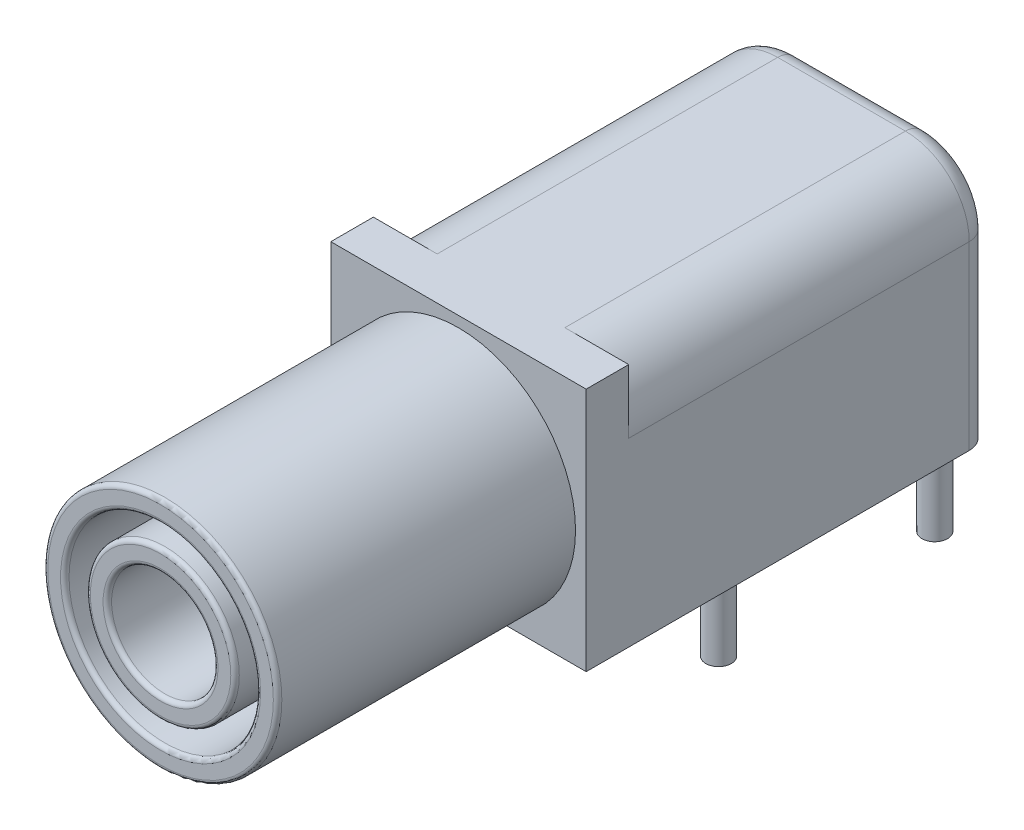
ISO-10303-21;
HEADER;
FILE_DESCRIPTION(('STEP AP214'),'2;1');
FILE_NAME('part.step','',(''),(''),'','','');
FILE_SCHEMA(('AUTOMOTIVE_DESIGN { 1 0 10303 214 1 1 1 1 }'));
ENDSEC;
DATA;
#1=APPLICATION_CONTEXT('core data for automotive mechanical design processes');
#2=APPLICATION_PROTOCOL_DEFINITION('international standard','automotive_design',2000,#1);
#3=PRODUCT_CONTEXT('',#1,'mechanical');
#4=PRODUCT('Part','Part','',(#3));
#5=PRODUCT_RELATED_PRODUCT_CATEGORY('part','',(#4));
#6=PRODUCT_DEFINITION_FORMATION('','',#4);
#7=PRODUCT_DEFINITION_CONTEXT('part definition',#1,'design');
#8=PRODUCT_DEFINITION('design','',#6,#7);
#9=PRODUCT_DEFINITION_SHAPE('','',#8);
#10=(LENGTH_UNIT() NAMED_UNIT(*) SI_UNIT(.MILLI.,.METRE.));
#11=(NAMED_UNIT(*) PLANE_ANGLE_UNIT() SI_UNIT($,.RADIAN.));
#12=(NAMED_UNIT(*) SI_UNIT($,.STERADIAN.) SOLID_ANGLE_UNIT());
#13=UNCERTAINTY_MEASURE_WITH_UNIT(LENGTH_MEASURE(1.E-05),#10,'distance_accuracy_value','');
#14=(GEOMETRIC_REPRESENTATION_CONTEXT(3) GLOBAL_UNCERTAINTY_ASSIGNED_CONTEXT((#13)) GLOBAL_UNIT_ASSIGNED_CONTEXT((#10,
#11,#12)) REPRESENTATION_CONTEXT('',''));
#15=CARTESIAN_POINT('',(0.,0.,0.));
#16=DIRECTION('',(0.,0.,1.));
#17=DIRECTION('',(1.,0.,0.));
#18=AXIS2_PLACEMENT_3D('',#15,#16,#17);
#19=CARTESIAN_POINT('',(-6.,-5.5,-19.));
#20=DIRECTION('',(0.,-1.,0.));
#21=DIRECTION('',(0.,0.,-1.));
#22=AXIS2_PLACEMENT_3D('',#19,#20,#21);
#23=PLANE('',#22);
#24=CARTESIAN_POINT('',(-5.08,-5.5,-7.14));
#25=DIRECTION('',(0.,-1.,0.));
#26=DIRECTION('',(0.,0.,1.));
#27=AXIS2_PLACEMENT_3D('',#24,#25,#26);
#28=CIRCLE('',#27,0.6);
#29=CARTESIAN_POINT('',(-5.08,-5.5,-6.54));
#30=VERTEX_POINT('',#29);
#31=EDGE_CURVE('E302',#30,#30,#28,.T.);
#32=ORIENTED_EDGE('',*,*,#31,.F.);
#33=EDGE_LOOP('',(#32));
#34=FACE_BOUND('',#33,.T.);
#35=CARTESIAN_POINT('',(5.08,-5.5,-17.3));
#36=DIRECTION('',(0.,-1.,0.));
#37=DIRECTION('',(0.,0.,-1.));
#38=AXIS2_PLACEMENT_3D('',#35,#36,#37);
#39=CIRCLE('',#38,0.6);
#40=CARTESIAN_POINT('',(5.08,-5.5,-17.9));
#41=VERTEX_POINT('',#40);
#42=EDGE_CURVE('E290',#41,#41,#39,.T.);
#43=ORIENTED_EDGE('',*,*,#42,.F.);
#44=EDGE_LOOP('',(#43));
#45=FACE_BOUND('',#44,.T.);
#46=DIRECTION('',(0.,0.,1.));
#47=VECTOR('',#46,1.);
#48=CARTESIAN_POINT('',(-6.,-5.5,-19.));
#49=LINE('',#48,#47);
#50=CARTESIAN_POINT('',(-6.,-5.5,-18.));
#51=VERTEX_POINT('',#50);
#52=CARTESIAN_POINT('',(-6.,-5.5,0.));
#53=VERTEX_POINT('',#52);
#54=EDGE_CURVE('E158',#51,#53,#49,.T.);
#55=ORIENTED_EDGE('',*,*,#54,.F.);
#56=CARTESIAN_POINT('',(-5.,-5.5,-18.));
#57=DIRECTION('',(0.,-1.,0.));
#58=DIRECTION('',(0.,0.,-1.));
#59=AXIS2_PLACEMENT_3D('',#56,#57,#58);
#60=CIRCLE('',#59,1.);
#61=CARTESIAN_POINT('',(-5.,-5.5,-19.));
#62=VERTEX_POINT('',#61);
#63=EDGE_CURVE('E227',#51,#62,#60,.T.);
#64=ORIENTED_EDGE('',*,*,#63,.T.);
#65=DIRECTION('',(1.,0.,0.));
#66=VECTOR('',#65,1.);
#67=CARTESIAN_POINT('',(-6.,-5.5,-19.));
#68=LINE('',#67,#66);
#69=CARTESIAN_POINT('',(5.,-5.5,-19.));
#70=VERTEX_POINT('',#69);
#71=EDGE_CURVE('E155',#62,#70,#68,.T.);
#72=ORIENTED_EDGE('',*,*,#71,.T.);
#73=CARTESIAN_POINT('',(5.,-5.5,-18.));
#74=DIRECTION('',(0.,-1.,0.));
#75=DIRECTION('',(0.,0.,-1.));
#76=AXIS2_PLACEMENT_3D('',#73,#74,#75);
#77=CIRCLE('',#76,1.);
#78=CARTESIAN_POINT('',(6.,-5.5,-18.));
#79=VERTEX_POINT('',#78);
#80=EDGE_CURVE('E225',#70,#79,#77,.T.);
#81=ORIENTED_EDGE('',*,*,#80,.T.);
#82=DIRECTION('',(0.,0.,1.));
#83=VECTOR('',#82,1.);
#84=CARTESIAN_POINT('',(6.,-5.5,-19.));
#85=LINE('',#84,#83);
#86=CARTESIAN_POINT('',(6.,-5.5,0.));
#87=VERTEX_POINT('',#86);
#88=EDGE_CURVE('E171',#79,#87,#85,.T.);
#89=ORIENTED_EDGE('',*,*,#88,.T.);
#90=DIRECTION('',(1.,0.,0.));
#91=VECTOR('',#90,1.);
#92=CARTESIAN_POINT('',(-6.,-5.5,0.));
#93=LINE('',#92,#91);
#94=CARTESIAN_POINT('',(0.,-5.5,0.));
#95=VERTEX_POINT('',#94);
#96=EDGE_CURVE('E168',#95,#87,#93,.T.);
#97=ORIENTED_EDGE('',*,*,#96,.F.);
#98=EDGE_CURVE('E159',#53,#95,#93,.T.);
#99=ORIENTED_EDGE('',*,*,#98,.F.);
#100=EDGE_LOOP('',(#55,#64,#72,#81,#89,#97,#99));
#101=FACE_BOUND('',#100,.T.);
#102=CARTESIAN_POINT('',(0.,-5.5,-13.5));
#103=DIRECTION('',(0.,-1.,0.));
#104=DIRECTION('',(0.,0.,-1.));
#105=AXIS2_PLACEMENT_3D('',#102,#103,#104);
#106=CIRCLE('',#105,1.1);
#107=CARTESIAN_POINT('',(0.,-5.5,-14.6));
#108=VERTEX_POINT('',#107);
#109=EDGE_CURVE('E284',#108,#108,#106,.T.);
#110=ORIENTED_EDGE('',*,*,#109,.F.);
#111=EDGE_LOOP('',(#110));
#112=FACE_BOUND('',#111,.T.);
#113=CARTESIAN_POINT('',(5.08,-5.5,-7.14));
#114=DIRECTION('',(0.,-1.,0.));
#115=DIRECTION('',(0.,0.,-1.));
#116=AXIS2_PLACEMENT_3D('',#113,#114,#115);
#117=CIRCLE('',#116,0.6);
#118=CARTESIAN_POINT('',(5.08,-5.5,-7.74));
#119=VERTEX_POINT('',#118);
#120=EDGE_CURVE('E296',#119,#119,#117,.T.);
#121=ORIENTED_EDGE('',*,*,#120,.F.);
#122=EDGE_LOOP('',(#121));
#123=FACE_BOUND('',#122,.T.);
#124=CARTESIAN_POINT('',(-5.08,-5.5,-17.3));
#125=DIRECTION('',(0.,-1.,0.));
#126=DIRECTION('',(0.,0.,1.));
#127=AXIS2_PLACEMENT_3D('',#124,#125,#126);
#128=CIRCLE('',#127,0.6);
#129=CARTESIAN_POINT('',(-5.08,-5.5,-16.7));
#130=VERTEX_POINT('',#129);
#131=EDGE_CURVE('E308',#130,#130,#128,.T.);
#132=ORIENTED_EDGE('',*,*,#131,.F.);
#133=EDGE_LOOP('',(#132));
#134=FACE_BOUND('',#133,.T.);
#135=ADVANCED_FACE('F40',(#34,#45,#101,#112,#123,#134),#23,.T.);
#136=CARTESIAN_POINT('',(-6.,6.,-19.));
#137=DIRECTION('',(0.,-1.,0.));
#138=DIRECTION('',(0.,0.,-1.));
#139=AXIS2_PLACEMENT_3D('',#136,#137,#138);
#140=PLANE('',#139);
#141=DIRECTION('',(0.,0.,-1.));
#142=VECTOR('',#141,1.);
#143=CARTESIAN_POINT('',(2.99999999999998,6.,-2.));
#144=LINE('',#143,#142);
#145=CARTESIAN_POINT('',(3.,6.,-2.));
#146=VERTEX_POINT('',#145);
#147=CARTESIAN_POINT('',(2.99999999999998,6.,-18.));
#148=VERTEX_POINT('',#147);
#149=EDGE_CURVE('E139',#146,#148,#144,.T.);
#150=ORIENTED_EDGE('',*,*,#149,.T.);
#151=DIRECTION('',(1.,0.,0.));
#152=VECTOR('',#151,1.);
#153=CARTESIAN_POINT('',(-2.99999999999998,6.,-18.));
#154=LINE('',#153,#152);
#155=CARTESIAN_POINT('',(-2.99999999999998,6.,-18.));
#156=VERTEX_POINT('',#155);
#157=EDGE_CURVE('E231',#148,#156,#154,.F.);
#158=ORIENTED_EDGE('',*,*,#157,.T.);
#159=DIRECTION('',(0.,0.,-1.));
#160=VECTOR('',#159,1.);
#161=CARTESIAN_POINT('',(-2.99999999999998,6.,-2.));
#162=LINE('',#161,#160);
#163=CARTESIAN_POINT('',(-2.99999999999998,6.,-2.));
#164=VERTEX_POINT('',#163);
#165=EDGE_CURVE('E144',#164,#156,#162,.T.);
#166=ORIENTED_EDGE('',*,*,#165,.F.);
#167=DIRECTION('',(1.,0.,0.));
#168=VECTOR('',#167,1.);
#169=CARTESIAN_POINT('',(-6.,6.,-2.));
#170=LINE('',#169,#168);
#171=CARTESIAN_POINT('',(-6.,6.,-2.));
#172=VERTEX_POINT('',#171);
#173=EDGE_CURVE('E149',#172,#164,#170,.T.);
#174=ORIENTED_EDGE('',*,*,#173,.F.);
#175=DIRECTION('',(0.,0.,1.));
#176=VECTOR('',#175,1.);
#177=CARTESIAN_POINT('',(-6.,6.,-19.));
#178=LINE('',#177,#176);
#179=CARTESIAN_POINT('',(-6.,6.,0.));
#180=VERTEX_POINT('',#179);
#181=EDGE_CURVE('E175',#172,#180,#178,.T.);
#182=ORIENTED_EDGE('',*,*,#181,.T.);
#183=DIRECTION('',(1.,0.,0.));
#184=VECTOR('',#183,1.);
#185=CARTESIAN_POINT('',(-6.,6.,0.));
#186=LINE('',#185,#184);
#187=CARTESIAN_POINT('',(6.,6.,0.));
#188=VERTEX_POINT('',#187);
#189=EDGE_CURVE('E162',#180,#188,#186,.T.);
#190=ORIENTED_EDGE('',*,*,#189,.T.);
#191=DIRECTION('',(0.,0.,1.));
#192=VECTOR('',#191,1.);
#193=CARTESIAN_POINT('',(6.,6.,-19.));
#194=LINE('',#193,#192);
#195=CARTESIAN_POINT('',(6.,6.,-2.));
#196=VERTEX_POINT('',#195);
#197=EDGE_CURVE('E173',#196,#188,#194,.T.);
#198=ORIENTED_EDGE('',*,*,#197,.F.);
#199=EDGE_CURVE('E132',#146,#196,#170,.T.);
#200=ORIENTED_EDGE('',*,*,#199,.F.);
#201=EDGE_LOOP('',(#150,#158,#166,#174,#182,#190,#198,#200));
#202=FACE_BOUND('',#201,.T.);
#203=ADVANCED_FACE('F324',(#202),#140,.F.);
#204=CARTESIAN_POINT('',(0.,0.,0.));
#205=DIRECTION('',(0.,0.,-1.));
#206=DIRECTION('',(-1.,0.,0.));
#207=AXIS2_PLACEMENT_3D('',#204,#205,#206);
#208=PLANE('',#207);
#209=CARTESIAN_POINT('',(0.,0.,0.));
#210=DIRECTION('',(0.,0.,1.));
#211=DIRECTION('',(1.,0.,0.));
#212=AXIS2_PLACEMENT_3D('',#209,#210,#211);
#213=CIRCLE('',#212,4.5);
#214=CARTESIAN_POINT('',(4.5,0.,0.));
#215=VERTEX_POINT('',#214);
#216=EDGE_CURVE('E177',#215,#215,#213,.T.);
#217=ORIENTED_EDGE('',*,*,#216,.T.);
#218=EDGE_LOOP('',(#217));
#219=FACE_BOUND('',#218,.T.);
#220=CARTESIAN_POINT('',(0.,0.,0.));
#221=DIRECTION('',(0.,0.,-1.));
#222=DIRECTION('',(-1.,0.,0.));
#223=AXIS2_PLACEMENT_3D('',#220,#221,#222);
#224=CIRCLE('',#223,3.5);
#225=CARTESIAN_POINT('',(-3.5,0.,0.));
#226=VERTEX_POINT('',#225);
#227=EDGE_CURVE('E183',#226,#226,#224,.F.);
#228=ORIENTED_EDGE('',*,*,#227,.F.);
#229=EDGE_LOOP('',(#228));
#230=FACE_BOUND('',#229,.T.);
#231=ADVANCED_FACE('F330',(#219,#230),#208,.F.);
#232=CARTESIAN_POINT('',(0.,0.,14.));
#233=DIRECTION('',(0.,0.,-1.));
#234=DIRECTION('',(-1.,0.,0.));
#235=AXIS2_PLACEMENT_3D('',#232,#233,#234);
#236=CYLINDRICAL_SURFACE('',#235,4.5);
#237=CARTESIAN_POINT('',(0.,0.,13.8));
#238=DIRECTION('',(0.,0.,1.));
#239=DIRECTION('',(1.,0.,0.));
#240=AXIS2_PLACEMENT_3D('',#237,#238,#239);
#241=CIRCLE('',#240,4.5);
#242=CARTESIAN_POINT('',(4.5,0.,13.8));
#243=VERTEX_POINT('',#242);
#244=EDGE_CURVE('E198',#243,#243,#241,.T.);
#245=ORIENTED_EDGE('',*,*,#244,.T.);
#246=EDGE_LOOP('',(#245));
#247=FACE_BOUND('',#246,.T.);
#248=ORIENTED_EDGE('',*,*,#216,.F.);
#249=EDGE_LOOP('',(#248));
#250=FACE_BOUND('',#249,.T.);
#251=ADVANCED_FACE('F351',(#247,#250),#236,.F.);
#252=CARTESIAN_POINT('',(0.,0.,14.));
#253=DIRECTION('',(0.,0.,-1.));
#254=DIRECTION('',(-1.,0.,0.));
#255=AXIS2_PLACEMENT_3D('',#252,#253,#254);
#256=CYLINDRICAL_SURFACE('',#255,5.5);
#257=CARTESIAN_POINT('',(0.,0.,13.8));
#258=DIRECTION('',(0.,0.,1.));
#259=DIRECTION('',(1.,0.,0.));
#260=AXIS2_PLACEMENT_3D('',#257,#258,#259);
#261=CIRCLE('',#260,5.5);
#262=CARTESIAN_POINT('',(5.5,0.,13.8));
#263=VERTEX_POINT('',#262);
#264=EDGE_CURVE('E207',#263,#263,#261,.F.);
#265=ORIENTED_EDGE('',*,*,#264,.T.);
#266=EDGE_LOOP('',(#265));
#267=FACE_BOUND('',#266,.T.);
#268=CARTESIAN_POINT('',(0.,0.,0.));
#269=DIRECTION('',(0.,0.,1.));
#270=DIRECTION('',(1.,0.,0.));
#271=AXIS2_PLACEMENT_3D('',#268,#269,#270);
#272=CIRCLE('',#271,5.5);
#273=EDGE_CURVE('E180',#95,#95,#272,.T.);
#274=ORIENTED_EDGE('',*,*,#273,.T.);
#275=EDGE_LOOP('',(#274));
#276=FACE_BOUND('',#275,.T.);
#277=ADVANCED_FACE('F347',(#267,#276),#256,.T.);
#278=CARTESIAN_POINT('',(0.,0.,14.));
#279=DIRECTION('',(0.,0.,1.));
#280=DIRECTION('',(1.,0.,0.));
#281=AXIS2_PLACEMENT_3D('',#278,#279,#280);
#282=PLANE('',#281);
#283=CARTESIAN_POINT('',(0.,0.,14.));
#284=DIRECTION('',(0.,0.,1.));
#285=DIRECTION('',(1.,0.,0.));
#286=AXIS2_PLACEMENT_3D('',#283,#284,#285);
#287=CIRCLE('',#286,4.7);
#288=CARTESIAN_POINT('',(4.7,0.,14.));
#289=VERTEX_POINT('',#288);
#290=EDGE_CURVE('E204',#289,#289,#287,.F.);
#291=ORIENTED_EDGE('',*,*,#290,.T.);
#292=EDGE_LOOP('',(#291));
#293=FACE_BOUND('',#292,.T.);
#294=CARTESIAN_POINT('',(0.,0.,14.));
#295=DIRECTION('',(0.,0.,1.));
#296=DIRECTION('',(1.,0.,0.));
#297=AXIS2_PLACEMENT_3D('',#294,#295,#296);
#298=CIRCLE('',#297,5.3);
#299=CARTESIAN_POINT('',(5.3,0.,14.));
#300=VERTEX_POINT('',#299);
#301=EDGE_CURVE('E201',#300,#300,#298,.T.);
#302=ORIENTED_EDGE('',*,*,#301,.T.);
#303=EDGE_LOOP('',(#302));
#304=FACE_BOUND('',#303,.T.);
#305=ADVANCED_FACE('F344',(#293,#304),#282,.T.);
#306=ORIENTED_EDGE('',*,*,#98,.T.);
#307=ORIENTED_EDGE('',*,*,#273,.F.);
#308=ORIENTED_EDGE('',*,*,#96,.T.);
#309=DIRECTION('',(0.,1.,0.));
#310=VECTOR('',#309,1.);
#311=CARTESIAN_POINT('',(6.,-5.5,0.));
#312=LINE('',#311,#310);
#313=EDGE_CURVE('E165',#87,#188,#312,.T.);
#314=ORIENTED_EDGE('',*,*,#313,.T.);
#315=ORIENTED_EDGE('',*,*,#189,.F.);
#316=DIRECTION('',(0.,1.,0.));
#317=VECTOR('',#316,1.);
#318=CARTESIAN_POINT('',(-6.,-5.5,0.));
#319=LINE('',#318,#317);
#320=EDGE_CURVE('E154',#53,#180,#319,.T.);
#321=ORIENTED_EDGE('',*,*,#320,.F.);
#322=EDGE_LOOP('',(#306,#307,#308,#314,#315,#321));
#323=FACE_BOUND('',#322,.T.);
#324=ADVANCED_FACE('F337',(#323),#208,.F.);
#325=CARTESIAN_POINT('',(0.,0.,-19.));
#326=DIRECTION('',(0.,0.,-1.));
#327=DIRECTION('',(-1.,0.,0.));
#328=AXIS2_PLACEMENT_3D('',#325,#326,#327);
#329=PLANE('',#328);
#330=ORIENTED_EDGE('',*,*,#71,.F.);
#331=DIRECTION('',(0.,1.,0.));
#332=VECTOR('',#331,1.);
#333=CARTESIAN_POINT('',(-5.,2.99999999999998,-19.));
#334=LINE('',#333,#332);
#335=CARTESIAN_POINT('',(-5.,2.99999999999998,-19.));
#336=VERTEX_POINT('',#335);
#337=EDGE_CURVE('E220',#62,#336,#334,.T.);
#338=ORIENTED_EDGE('',*,*,#337,.T.);
#339=CARTESIAN_POINT('',(-3.,3.,-19.));
#340=DIRECTION('',(0.,0.,-1.));
#341=DIRECTION('',(-1.,0.,0.));
#342=AXIS2_PLACEMENT_3D('',#339,#340,#341);
#343=CIRCLE('',#342,2.);
#344=CARTESIAN_POINT('',(-2.99999999999998,5.,-19.));
#345=VERTEX_POINT('',#344);
#346=EDGE_CURVE('E218',#336,#345,#343,.T.);
#347=ORIENTED_EDGE('',*,*,#346,.T.);
#348=DIRECTION('',(1.,0.,0.));
#349=VECTOR('',#348,1.);
#350=CARTESIAN_POINT('',(2.99999999999998,5.,-19.));
#351=LINE('',#350,#349);
#352=CARTESIAN_POINT('',(2.99999999999998,5.,-19.));
#353=VERTEX_POINT('',#352);
#354=EDGE_CURVE('E216',#345,#353,#351,.T.);
#355=ORIENTED_EDGE('',*,*,#354,.T.);
#356=CARTESIAN_POINT('',(3.,3.,-19.));
#357=DIRECTION('',(0.,0.,-1.));
#358=DIRECTION('',(-1.,0.,0.));
#359=AXIS2_PLACEMENT_3D('',#356,#357,#358);
#360=CIRCLE('',#359,2.);
#361=CARTESIAN_POINT('',(5.,2.99999999999999,-19.));
#362=VERTEX_POINT('',#361);
#363=EDGE_CURVE('E214',#353,#362,#360,.T.);
#364=ORIENTED_EDGE('',*,*,#363,.T.);
#365=DIRECTION('',(0.,1.,0.));
#366=VECTOR('',#365,1.);
#367=CARTESIAN_POINT('',(5.,0.,-19.));
#368=LINE('',#367,#366);
#369=EDGE_CURVE('E212',#362,#70,#368,.F.);
#370=ORIENTED_EDGE('',*,*,#369,.T.);
#371=EDGE_LOOP('',(#330,#338,#347,#355,#364,#370));
#372=FACE_BOUND('',#371,.T.);
#373=ADVANCED_FACE('F254',(#372),#329,.T.);
#374=CARTESIAN_POINT('',(6.,-5.5,-19.));
#375=DIRECTION('',(1.,0.,0.));
#376=DIRECTION('',(0.,0.,-1.));
#377=AXIS2_PLACEMENT_3D('',#374,#375,#376);
#378=PLANE('',#377);
#379=ORIENTED_EDGE('',*,*,#88,.F.);
#380=DIRECTION('',(0.,1.,0.));
#381=VECTOR('',#380,1.);
#382=CARTESIAN_POINT('',(6.,-5.5,-18.));
#383=LINE('',#382,#381);
#384=CARTESIAN_POINT('',(6.,2.99999999999998,-18.));
#385=VERTEX_POINT('',#384);
#386=EDGE_CURVE('E12',#79,#385,#383,.T.);
#387=ORIENTED_EDGE('',*,*,#386,.T.);
#388=DIRECTION('',(0.,0.,-1.));
#389=VECTOR('',#388,1.);
#390=CARTESIAN_POINT('',(6.,2.99999999999998,-2.));
#391=LINE('',#390,#389);
#392=CARTESIAN_POINT('',(6.,2.99999999999998,-2.));
#393=VERTEX_POINT('',#392);
#394=EDGE_CURVE('E137',#393,#385,#391,.T.);
#395=ORIENTED_EDGE('',*,*,#394,.F.);
#396=DIRECTION('',(0.,1.,0.));
#397=VECTOR('',#396,1.);
#398=CARTESIAN_POINT('',(6.,-5.5,-2.));
#399=LINE('',#398,#397);
#400=EDGE_CURVE('E127',#393,#196,#399,.T.);
#401=ORIENTED_EDGE('',*,*,#400,.T.);
#402=ORIENTED_EDGE('',*,*,#197,.T.);
#403=ORIENTED_EDGE('',*,*,#313,.F.);
#404=EDGE_LOOP('',(#379,#387,#395,#401,#402,#403));
#405=FACE_BOUND('',#404,.T.);
#406=ADVANCED_FACE('F142',(#405),#378,.T.);
#407=CARTESIAN_POINT('',(-6.,-5.5,-19.));
#408=DIRECTION('',(1.,0.,0.));
#409=DIRECTION('',(0.,0.,-1.));
#410=AXIS2_PLACEMENT_3D('',#407,#408,#409);
#411=PLANE('',#410);
#412=DIRECTION('',(0.,0.,-1.));
#413=VECTOR('',#412,1.);
#414=CARTESIAN_POINT('',(-6.,2.99999999999998,-2.));
#415=LINE('',#414,#413);
#416=CARTESIAN_POINT('',(-6.,3.,-2.));
#417=VERTEX_POINT('',#416);
#418=CARTESIAN_POINT('',(-6.,2.99999999999998,-18.));
#419=VERTEX_POINT('',#418);
#420=EDGE_CURVE('E150',#417,#419,#415,.T.);
#421=ORIENTED_EDGE('',*,*,#420,.T.);
#422=DIRECTION('',(0.,1.,0.));
#423=VECTOR('',#422,1.);
#424=CARTESIAN_POINT('',(-6.,-5.5,-18.));
#425=LINE('',#424,#423);
#426=EDGE_CURVE('E223',#419,#51,#425,.F.);
#427=ORIENTED_EDGE('',*,*,#426,.T.);
#428=ORIENTED_EDGE('',*,*,#54,.T.);
#429=ORIENTED_EDGE('',*,*,#320,.T.);
#430=ORIENTED_EDGE('',*,*,#181,.F.);
#431=DIRECTION('',(0.,1.,0.));
#432=VECTOR('',#431,1.);
#433=CARTESIAN_POINT('',(-6.,-5.5,-2.));
#434=LINE('',#433,#432);
#435=EDGE_CURVE('E210',#417,#172,#434,.T.);
#436=ORIENTED_EDGE('',*,*,#435,.F.);
#437=EDGE_LOOP('',(#421,#427,#428,#429,#430,#436));
#438=FACE_BOUND('',#437,.T.);
#439=ADVANCED_FACE('F280',(#438),#411,.F.);
#440=CARTESIAN_POINT('',(0.,0.,14.));
#441=DIRECTION('',(0.,0.,-1.));
#442=DIRECTION('',(-1.,0.,0.));
#443=AXIS2_PLACEMENT_3D('',#440,#441,#442);
#444=CYLINDRICAL_SURFACE('',#443,2.5);
#445=CARTESIAN_POINT('',(0.,0.,13.8));
#446=DIRECTION('',(0.,0.,1.));
#447=DIRECTION('',(1.,0.,0.));
#448=AXIS2_PLACEMENT_3D('',#445,#446,#447);
#449=CIRCLE('',#448,2.5);
#450=CARTESIAN_POINT('',(2.5,0.,13.8));
#451=VERTEX_POINT('',#450);
#452=EDGE_CURVE('E186',#451,#451,#449,.T.);
#453=ORIENTED_EDGE('',*,*,#452,.T.);
#454=EDGE_LOOP('',(#453));
#455=FACE_BOUND('',#454,.T.);
#456=CARTESIAN_POINT('',(0.,0.,0.));
#457=DIRECTION('',(0.,0.,1.));
#458=DIRECTION('',(1.,0.,0.));
#459=AXIS2_PLACEMENT_3D('',#456,#457,#458);
#460=CIRCLE('',#459,2.5);
#461=CARTESIAN_POINT('',(2.5,0.,0.));
#462=VERTEX_POINT('',#461);
#463=EDGE_CURVE('E134',#462,#462,#460,.T.);
#464=ORIENTED_EDGE('',*,*,#463,.F.);
#465=EDGE_LOOP('',(#464));
#466=FACE_BOUND('',#465,.T.);
#467=ADVANCED_FACE('F343',(#455,#466),#444,.F.);
#468=CARTESIAN_POINT('',(0.,0.,14.));
#469=DIRECTION('',(0.,0.,-1.));
#470=DIRECTION('',(-1.,0.,0.));
#471=AXIS2_PLACEMENT_3D('',#468,#469,#470);
#472=CYLINDRICAL_SURFACE('',#471,3.5);
#473=CARTESIAN_POINT('',(0.,0.,13.8));
#474=DIRECTION('',(0.,0.,1.));
#475=DIRECTION('',(1.,0.,0.));
#476=AXIS2_PLACEMENT_3D('',#473,#474,#475);
#477=CIRCLE('',#476,3.5);
#478=CARTESIAN_POINT('',(3.5,0.,13.8));
#479=VERTEX_POINT('',#478);
#480=EDGE_CURVE('E195',#479,#479,#477,.F.);
#481=ORIENTED_EDGE('',*,*,#480,.T.);
#482=EDGE_LOOP('',(#481));
#483=FACE_BOUND('',#482,.T.);
#484=ORIENTED_EDGE('',*,*,#227,.T.);
#485=EDGE_LOOP('',(#484));
#486=FACE_BOUND('',#485,.T.);
#487=ADVANCED_FACE('F420',(#483,#486),#472,.T.);
#488=CARTESIAN_POINT('',(0.,0.,14.));
#489=DIRECTION('',(0.,0.,1.));
#490=DIRECTION('',(1.,0.,0.));
#491=AXIS2_PLACEMENT_3D('',#488,#489,#490);
#492=PLANE('',#491);
#493=CARTESIAN_POINT('',(0.,0.,14.));
#494=DIRECTION('',(0.,0.,1.));
#495=DIRECTION('',(1.,0.,0.));
#496=AXIS2_PLACEMENT_3D('',#493,#494,#495);
#497=CIRCLE('',#496,2.7);
#498=CARTESIAN_POINT('',(2.7,0.,14.));
#499=VERTEX_POINT('',#498);
#500=EDGE_CURVE('E192',#499,#499,#497,.F.);
#501=ORIENTED_EDGE('',*,*,#500,.T.);
#502=EDGE_LOOP('',(#501));
#503=FACE_BOUND('',#502,.T.);
#504=CARTESIAN_POINT('',(0.,0.,14.));
#505=DIRECTION('',(0.,0.,1.));
#506=DIRECTION('',(1.,0.,0.));
#507=AXIS2_PLACEMENT_3D('',#504,#505,#506);
#508=CIRCLE('',#507,3.3);
#509=CARTESIAN_POINT('',(3.3,0.,14.));
#510=VERTEX_POINT('',#509);
#511=EDGE_CURVE('E189',#510,#510,#508,.T.);
#512=ORIENTED_EDGE('',*,*,#511,.T.);
#513=EDGE_LOOP('',(#512));
#514=FACE_BOUND('',#513,.T.);
#515=ADVANCED_FACE('F415',(#503,#514),#492,.T.);
#516=ORIENTED_EDGE('',*,*,#463,.T.);
#517=EDGE_LOOP('',(#516));
#518=FACE_BOUND('',#517,.T.);
#519=ADVANCED_FACE('F360',(#518),#208,.F.);
#520=CARTESIAN_POINT('',(0.,0.,13.8));
#521=DIRECTION('',(0.,0.,1.));
#522=DIRECTION('',(1.,0.,0.));
#523=AXIS2_PLACEMENT_3D('',#520,#521,#522);
#524=TOROIDAL_SURFACE('',#523,2.7,0.2);
#525=ORIENTED_EDGE('',*,*,#500,.F.);
#526=EDGE_LOOP('',(#525));
#527=FACE_BOUND('',#526,.T.);
#528=ORIENTED_EDGE('',*,*,#452,.F.);
#529=EDGE_LOOP('',(#528));
#530=FACE_BOUND('',#529,.T.);
#531=ADVANCED_FACE('F356',(#527,#530),#524,.T.);
#532=CARTESIAN_POINT('',(0.,0.,13.8));
#533=DIRECTION('',(0.,0.,1.));
#534=DIRECTION('',(1.,0.,0.));
#535=AXIS2_PLACEMENT_3D('',#532,#533,#534);
#536=TOROIDAL_SURFACE('',#535,3.3,0.2);
#537=ORIENTED_EDGE('',*,*,#480,.F.);
#538=EDGE_LOOP('',(#537));
#539=FACE_BOUND('',#538,.T.);
#540=ORIENTED_EDGE('',*,*,#511,.F.);
#541=EDGE_LOOP('',(#540));
#542=FACE_BOUND('',#541,.T.);
#543=ADVANCED_FACE('F359',(#539,#542),#536,.T.);
#544=CARTESIAN_POINT('',(0.,0.,13.8));
#545=DIRECTION('',(0.,0.,1.));
#546=DIRECTION('',(1.,0.,0.));
#547=AXIS2_PLACEMENT_3D('',#544,#545,#546);
#548=TOROIDAL_SURFACE('',#547,4.7,0.2);
#549=ORIENTED_EDGE('',*,*,#290,.F.);
#550=EDGE_LOOP('',(#549));
#551=FACE_BOUND('',#550,.T.);
#552=ORIENTED_EDGE('',*,*,#244,.F.);
#553=EDGE_LOOP('',(#552));
#554=FACE_BOUND('',#553,.T.);
#555=ADVANCED_FACE('F364',(#551,#554),#548,.T.);
#556=CARTESIAN_POINT('',(0.,0.,13.8));
#557=DIRECTION('',(0.,0.,1.));
#558=DIRECTION('',(1.,0.,0.));
#559=AXIS2_PLACEMENT_3D('',#556,#557,#558);
#560=TOROIDAL_SURFACE('',#559,5.3,0.2);
#561=ORIENTED_EDGE('',*,*,#264,.F.);
#562=EDGE_LOOP('',(#561));
#563=FACE_BOUND('',#562,.T.);
#564=ORIENTED_EDGE('',*,*,#301,.F.);
#565=EDGE_LOOP('',(#564));
#566=FACE_BOUND('',#565,.T.);
#567=ADVANCED_FACE('F368',(#563,#566),#560,.T.);
#568=CARTESIAN_POINT('',(3.,3.,-2.));
#569=DIRECTION('',(0.,0.,-1.));
#570=DIRECTION('',(-1.,0.,0.));
#571=AXIS2_PLACEMENT_3D('',#568,#569,#570);
#572=PLANE('',#571);
#573=ORIENTED_EDGE('',*,*,#173,.T.);
#574=CARTESIAN_POINT('',(-3.,3.,-2.));
#575=DIRECTION('',(0.,0.,1.));
#576=DIRECTION('',(-1.,0.,0.));
#577=AXIS2_PLACEMENT_3D('',#574,#575,#576);
#578=CIRCLE('',#577,3.);
#579=EDGE_CURVE('E140',#164,#417,#578,.T.);
#580=ORIENTED_EDGE('',*,*,#579,.T.);
#581=ORIENTED_EDGE('',*,*,#435,.T.);
#582=EDGE_LOOP('',(#573,#580,#581));
#583=FACE_BOUND('',#582,.T.);
#584=ADVANCED_FACE('F372',(#583),#572,.T.);
#585=CARTESIAN_POINT('',(-3.,3.,-2.));
#586=DIRECTION('',(0.,0.,-1.));
#587=DIRECTION('',(-1.,0.,0.));
#588=AXIS2_PLACEMENT_3D('',#585,#586,#587);
#589=CYLINDRICAL_SURFACE('',#588,3.);
#590=ORIENTED_EDGE('',*,*,#165,.T.);
#591=CARTESIAN_POINT('',(-3.,3.,-18.));
#592=DIRECTION('',(0.,0.,-1.));
#593=DIRECTION('',(-1.,0.,0.));
#594=AXIS2_PLACEMENT_3D('',#591,#592,#593);
#595=CIRCLE('',#594,3.);
#596=EDGE_CURVE('E229',#156,#419,#595,.F.);
#597=ORIENTED_EDGE('',*,*,#596,.T.);
#598=ORIENTED_EDGE('',*,*,#420,.F.);
#599=ORIENTED_EDGE('',*,*,#579,.F.);
#600=EDGE_LOOP('',(#590,#597,#598,#599));
#601=FACE_BOUND('',#600,.T.);
#602=ADVANCED_FACE('F275',(#601),#589,.T.);
#603=CARTESIAN_POINT('',(3.,3.,-2.));
#604=DIRECTION('',(0.,0.,-1.));
#605=DIRECTION('',(-1.,0.,0.));
#606=AXIS2_PLACEMENT_3D('',#603,#604,#605);
#607=CYLINDRICAL_SURFACE('',#606,3.);
#608=ORIENTED_EDGE('',*,*,#394,.T.);
#609=CARTESIAN_POINT('',(3.,3.,-18.));
#610=DIRECTION('',(0.,0.,-1.));
#611=DIRECTION('',(-1.,0.,0.));
#612=AXIS2_PLACEMENT_3D('',#609,#610,#611);
#613=CIRCLE('',#612,3.);
#614=EDGE_CURVE('E49',#385,#148,#613,.F.);
#615=ORIENTED_EDGE('',*,*,#614,.T.);
#616=ORIENTED_EDGE('',*,*,#149,.F.);
#617=CARTESIAN_POINT('',(3.,3.,-2.));
#618=DIRECTION('',(0.,0.,1.));
#619=DIRECTION('',(-1.,0.,0.));
#620=AXIS2_PLACEMENT_3D('',#617,#618,#619);
#621=CIRCLE('',#620,3.);
#622=EDGE_CURVE('E130',#393,#146,#621,.T.);
#623=ORIENTED_EDGE('',*,*,#622,.F.);
#624=EDGE_LOOP('',(#608,#615,#616,#623));
#625=FACE_BOUND('',#624,.T.);
#626=ADVANCED_FACE('F136',(#625),#607,.T.);
#627=ORIENTED_EDGE('',*,*,#622,.T.);
#628=ORIENTED_EDGE('',*,*,#199,.T.);
#629=ORIENTED_EDGE('',*,*,#400,.F.);
#630=EDGE_LOOP('',(#627,#628,#629));
#631=FACE_BOUND('',#630,.T.);
#632=ADVANCED_FACE('F129',(#631),#572,.T.);
#633=CARTESIAN_POINT('',(5.,-5.5,-18.));
#634=DIRECTION('',(0.,1.,0.));
#635=DIRECTION('',(0.,0.,1.));
#636=AXIS2_PLACEMENT_3D('',#633,#634,#635);
#637=CYLINDRICAL_SURFACE('',#636,1.);
#638=ORIENTED_EDGE('',*,*,#80,.F.);
#639=ORIENTED_EDGE('',*,*,#369,.F.);
#640=CARTESIAN_POINT('',(5.,2.99999999999998,-18.));
#641=DIRECTION('',(0.,1.,0.));
#642=DIRECTION('',(0.,0.,1.));
#643=AXIS2_PLACEMENT_3D('',#640,#641,#642);
#644=CIRCLE('',#643,1.);
#645=EDGE_CURVE('E44',#385,#362,#644,.T.);
#646=ORIENTED_EDGE('',*,*,#645,.F.);
#647=ORIENTED_EDGE('',*,*,#386,.F.);
#648=EDGE_LOOP('',(#638,#639,#646,#647));
#649=FACE_BOUND('',#648,.T.);
#650=ADVANCED_FACE('F42',(#649),#637,.T.);
#651=CARTESIAN_POINT('',(3.,3.,-18.));
#652=DIRECTION('',(0.,0.,-1.));
#653=DIRECTION('',(-1.,0.,0.));
#654=AXIS2_PLACEMENT_3D('',#651,#652,#653);
#655=TOROIDAL_SURFACE('',#654,2.,1.);
#656=ORIENTED_EDGE('',*,*,#645,.T.);
#657=ORIENTED_EDGE('',*,*,#363,.F.);
#658=CARTESIAN_POINT('',(2.99999999999999,5.,-18.));
#659=DIRECTION('',(-1.,0.,0.));
#660=DIRECTION('',(0.,-1.,0.));
#661=AXIS2_PLACEMENT_3D('',#658,#659,#660);
#662=CIRCLE('',#661,1.);
#663=EDGE_CURVE('E239',#148,#353,#662,.T.);
#664=ORIENTED_EDGE('',*,*,#663,.F.);
#665=ORIENTED_EDGE('',*,*,#614,.F.);
#666=EDGE_LOOP('',(#656,#657,#664,#665));
#667=FACE_BOUND('',#666,.T.);
#668=ADVANCED_FACE('F248',(#667),#655,.T.);
#669=CARTESIAN_POINT('',(0.,5.,-18.));
#670=DIRECTION('',(-1.,0.,0.));
#671=DIRECTION('',(0.,0.,1.));
#672=AXIS2_PLACEMENT_3D('',#669,#670,#671);
#673=CYLINDRICAL_SURFACE('',#672,1.);
#674=ORIENTED_EDGE('',*,*,#663,.T.);
#675=ORIENTED_EDGE('',*,*,#354,.F.);
#676=CARTESIAN_POINT('',(-2.99999999999998,5.,-18.));
#677=DIRECTION('',(-1.,0.,0.));
#678=DIRECTION('',(0.,0.,1.));
#679=AXIS2_PLACEMENT_3D('',#676,#677,#678);
#680=CIRCLE('',#679,1.);
#681=EDGE_CURVE('E236',#156,#345,#680,.T.);
#682=ORIENTED_EDGE('',*,*,#681,.F.);
#683=ORIENTED_EDGE('',*,*,#157,.F.);
#684=EDGE_LOOP('',(#674,#675,#682,#683));
#685=FACE_BOUND('',#684,.T.);
#686=ADVANCED_FACE('F268',(#685),#673,.T.);
#687=CARTESIAN_POINT('',(-3.,3.,-18.));
#688=DIRECTION('',(0.,0.,-1.));
#689=DIRECTION('',(-1.,0.,0.));
#690=AXIS2_PLACEMENT_3D('',#687,#688,#689);
#691=TOROIDAL_SURFACE('',#690,2.,1.);
#692=ORIENTED_EDGE('',*,*,#681,.T.);
#693=ORIENTED_EDGE('',*,*,#346,.F.);
#694=CARTESIAN_POINT('',(-5.,2.99999999999999,-18.));
#695=DIRECTION('',(0.,-1.,0.));
#696=DIRECTION('',(1.,0.,0.));
#697=AXIS2_PLACEMENT_3D('',#694,#695,#696);
#698=CIRCLE('',#697,1.);
#699=EDGE_CURVE('E234',#419,#336,#698,.T.);
#700=ORIENTED_EDGE('',*,*,#699,.F.);
#701=ORIENTED_EDGE('',*,*,#596,.F.);
#702=EDGE_LOOP('',(#692,#693,#700,#701));
#703=FACE_BOUND('',#702,.T.);
#704=ADVANCED_FACE('F270',(#703),#691,.T.);
#705=CARTESIAN_POINT('',(-5.,0.,-18.));
#706=DIRECTION('',(0.,-1.,0.));
#707=DIRECTION('',(0.,0.,-1.));
#708=AXIS2_PLACEMENT_3D('',#705,#706,#707);
#709=CYLINDRICAL_SURFACE('',#708,1.);
#710=ORIENTED_EDGE('',*,*,#63,.F.);
#711=ORIENTED_EDGE('',*,*,#426,.F.);
#712=ORIENTED_EDGE('',*,*,#699,.T.);
#713=ORIENTED_EDGE('',*,*,#337,.F.);
#714=EDGE_LOOP('',(#710,#711,#712,#713));
#715=FACE_BOUND('',#714,.T.);
#716=ADVANCED_FACE('F263',(#715),#709,.T.);
#717=CARTESIAN_POINT('',(0.,-8.9,-13.5));
#718=DIRECTION('',(0.,1.,0.));
#719=DIRECTION('',(0.,0.,1.));
#720=AXIS2_PLACEMENT_3D('',#717,#718,#719);
#721=CYLINDRICAL_SURFACE('',#720,1.1);
#722=CARTESIAN_POINT('',(0.,-8.9,-13.5));
#723=DIRECTION('',(0.,-1.,0.));
#724=DIRECTION('',(0.,0.,-1.));
#725=AXIS2_PLACEMENT_3D('',#722,#723,#724);
#726=CIRCLE('',#725,1.1);
#727=CARTESIAN_POINT('',(0.,-8.9,-14.6));
#728=VERTEX_POINT('',#727);
#729=EDGE_CURVE('E237',#728,#728,#726,.T.);
#730=ORIENTED_EDGE('',*,*,#729,.F.);
#731=EDGE_LOOP('',(#730));
#732=FACE_BOUND('',#731,.T.);
#733=ORIENTED_EDGE('',*,*,#109,.T.);
#734=EDGE_LOOP('',(#733));
#735=FACE_BOUND('',#734,.T.);
#736=ADVANCED_FACE('F376',(#732,#735),#721,.T.);
#737=CARTESIAN_POINT('',(0.,-8.9,-13.5));
#738=DIRECTION('',(0.,-1.,0.));
#739=DIRECTION('',(0.,0.,-1.));
#740=AXIS2_PLACEMENT_3D('',#737,#738,#739);
#741=PLANE('',#740);
#742=ORIENTED_EDGE('',*,*,#729,.T.);
#743=EDGE_LOOP('',(#742));
#744=FACE_BOUND('',#743,.T.);
#745=ADVANCED_FACE('F558',(#744),#741,.T.);
#746=CARTESIAN_POINT('',(5.08,-8.9,-17.3));
#747=DIRECTION('',(0.,1.,0.));
#748=DIRECTION('',(0.,0.,1.));
#749=AXIS2_PLACEMENT_3D('',#746,#747,#748);
#750=CYLINDRICAL_SURFACE('',#749,0.6);
#751=CARTESIAN_POINT('',(5.08,-8.9,-17.3));
#752=DIRECTION('',(0.,-1.,0.));
#753=DIRECTION('',(0.,0.,-1.));
#754=AXIS2_PLACEMENT_3D('',#751,#752,#753);
#755=CIRCLE('',#754,0.6);
#756=CARTESIAN_POINT('',(5.08,-8.9,-17.9));
#757=VERTEX_POINT('',#756);
#758=EDGE_CURVE('E287',#757,#757,#755,.T.);
#759=ORIENTED_EDGE('',*,*,#758,.F.);
#760=EDGE_LOOP('',(#759));
#761=FACE_BOUND('',#760,.T.);
#762=ORIENTED_EDGE('',*,*,#42,.T.);
#763=EDGE_LOOP('',(#762));
#764=FACE_BOUND('',#763,.T.);
#765=ADVANCED_FACE('F567',(#761,#764),#750,.T.);
#766=CARTESIAN_POINT('',(5.08,-8.9,-17.3));
#767=DIRECTION('',(0.,-1.,0.));
#768=DIRECTION('',(0.,0.,-1.));
#769=AXIS2_PLACEMENT_3D('',#766,#767,#768);
#770=PLANE('',#769);
#771=ORIENTED_EDGE('',*,*,#758,.T.);
#772=EDGE_LOOP('',(#771));
#773=FACE_BOUND('',#772,.T.);
#774=ADVANCED_FACE('F577',(#773),#770,.T.);
#775=CARTESIAN_POINT('',(5.08,-8.9,-7.14));
#776=DIRECTION('',(0.,1.,0.));
#777=DIRECTION('',(0.,0.,1.));
#778=AXIS2_PLACEMENT_3D('',#775,#776,#777);
#779=CYLINDRICAL_SURFACE('',#778,0.6);
#780=CARTESIAN_POINT('',(5.08,-8.9,-7.14));
#781=DIRECTION('',(0.,-1.,0.));
#782=DIRECTION('',(0.,0.,-1.));
#783=AXIS2_PLACEMENT_3D('',#780,#781,#782);
#784=CIRCLE('',#783,0.6);
#785=CARTESIAN_POINT('',(5.08,-8.9,-7.74));
#786=VERTEX_POINT('',#785);
#787=EDGE_CURVE('E293',#786,#786,#784,.T.);
#788=ORIENTED_EDGE('',*,*,#787,.F.);
#789=EDGE_LOOP('',(#788));
#790=FACE_BOUND('',#789,.T.);
#791=ORIENTED_EDGE('',*,*,#120,.T.);
#792=EDGE_LOOP('',(#791));
#793=FACE_BOUND('',#792,.T.);
#794=ADVANCED_FACE('F587',(#790,#793),#779,.T.);
#795=CARTESIAN_POINT('',(5.08,-8.9,-7.14));
#796=DIRECTION('',(0.,-1.,0.));
#797=DIRECTION('',(0.,0.,-1.));
#798=AXIS2_PLACEMENT_3D('',#795,#796,#797);
#799=PLANE('',#798);
#800=ORIENTED_EDGE('',*,*,#787,.T.);
#801=EDGE_LOOP('',(#800));
#802=FACE_BOUND('',#801,.T.);
#803=ADVANCED_FACE('F597',(#802),#799,.T.);
#804=CARTESIAN_POINT('',(-5.08,-8.9,-7.14));
#805=DIRECTION('',(0.,1.,0.));
#806=DIRECTION('',(0.,0.,1.));
#807=AXIS2_PLACEMENT_3D('',#804,#805,#806);
#808=CYLINDRICAL_SURFACE('',#807,0.6);
#809=CARTESIAN_POINT('',(-5.08,-8.9,-7.14));
#810=DIRECTION('',(0.,-1.,0.));
#811=DIRECTION('',(0.,0.,1.));
#812=AXIS2_PLACEMENT_3D('',#809,#810,#811);
#813=CIRCLE('',#812,0.6);
#814=CARTESIAN_POINT('',(-5.08,-8.9,-6.54));
#815=VERTEX_POINT('',#814);
#816=EDGE_CURVE('E299',#815,#815,#813,.T.);
#817=ORIENTED_EDGE('',*,*,#816,.F.);
#818=EDGE_LOOP('',(#817));
#819=FACE_BOUND('',#818,.T.);
#820=ORIENTED_EDGE('',*,*,#31,.T.);
#821=EDGE_LOOP('',(#820));
#822=FACE_BOUND('',#821,.T.);
#823=ADVANCED_FACE('F607',(#819,#822),#808,.T.);
#824=CARTESIAN_POINT('',(-5.08,-8.9,-7.14));
#825=DIRECTION('',(0.,1.,0.));
#826=DIRECTION('',(0.,0.,1.));
#827=AXIS2_PLACEMENT_3D('',#824,#825,#826);
#828=PLANE('',#827);
#829=ORIENTED_EDGE('',*,*,#816,.T.);
#830=EDGE_LOOP('',(#829));
#831=FACE_BOUND('',#830,.T.);
#832=ADVANCED_FACE('F319',(#831),#828,.F.);
#833=CARTESIAN_POINT('',(-5.08,-8.9,-17.3));
#834=DIRECTION('',(0.,1.,0.));
#835=DIRECTION('',(0.,0.,1.));
#836=AXIS2_PLACEMENT_3D('',#833,#834,#835);
#837=CYLINDRICAL_SURFACE('',#836,0.6);
#838=CARTESIAN_POINT('',(-5.08,-8.9,-17.3));
#839=DIRECTION('',(0.,-1.,0.));
#840=DIRECTION('',(0.,0.,1.));
#841=AXIS2_PLACEMENT_3D('',#838,#839,#840);
#842=CIRCLE('',#841,0.6);
#843=CARTESIAN_POINT('',(-5.08,-8.9,-16.7));
#844=VERTEX_POINT('',#843);
#845=EDGE_CURVE('E305',#844,#844,#842,.T.);
#846=ORIENTED_EDGE('',*,*,#845,.F.);
#847=EDGE_LOOP('',(#846));
#848=FACE_BOUND('',#847,.T.);
#849=ORIENTED_EDGE('',*,*,#131,.T.);
#850=EDGE_LOOP('',(#849));
#851=FACE_BOUND('',#850,.T.);
#852=ADVANCED_FACE('F316',(#848,#851),#837,.T.);
#853=CARTESIAN_POINT('',(-5.08,-8.9,-17.3));
#854=DIRECTION('',(0.,1.,0.));
#855=DIRECTION('',(0.,0.,1.));
#856=AXIS2_PLACEMENT_3D('',#853,#854,#855);
#857=PLANE('',#856);
#858=ORIENTED_EDGE('',*,*,#845,.T.);
#859=EDGE_LOOP('',(#858));
#860=FACE_BOUND('',#859,.T.);
#861=ADVANCED_FACE('F314',(#860),#857,.F.);
#862=CLOSED_SHELL('',(#135,#203,#231,#251,#277,#305,#324,#373,#406,#439,#467,#487,#515,#519,
#531,#543,#555,#567,#584,#602,#626,#632,#650,#668,#686,#704,#716,#736,#745,#765,#774,#794,#803,
#823,#832,#852,#861));
#863=MANIFOLD_SOLID_BREP('B2',#862);
#864=ADVANCED_BREP_SHAPE_REPRESENTATION('',(#18,#863),#14);
#865=SHAPE_DEFINITION_REPRESENTATION(#9,#864);
ENDSEC;
END-ISO-10303-21;
